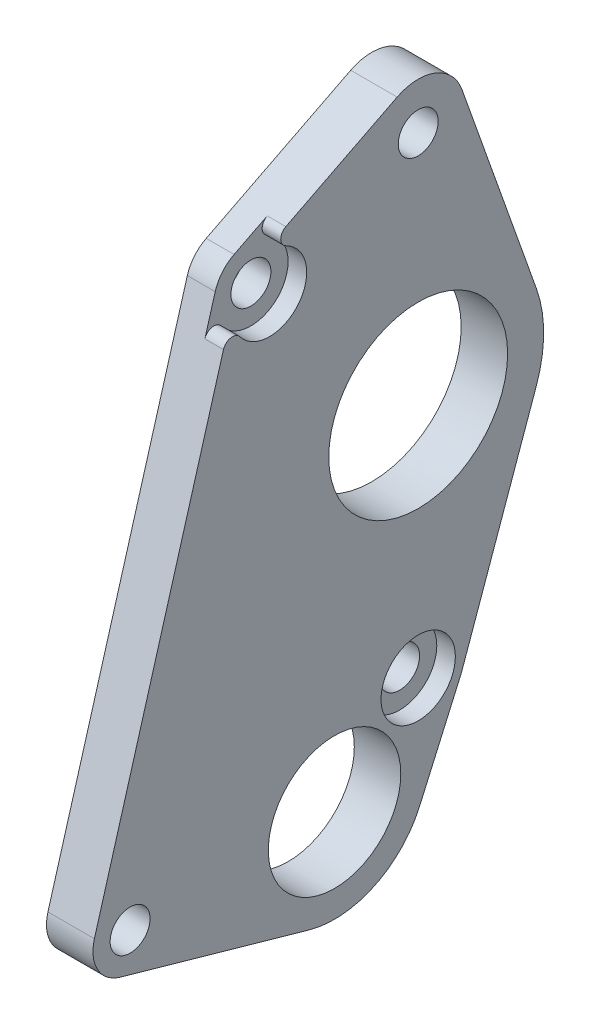
ISO-10303-21;
HEADER;
FILE_DESCRIPTION(('STEP AP214'),'2;1');
FILE_NAME('part.step','',(''),(''),'','','');
FILE_SCHEMA(('AUTOMOTIVE_DESIGN { 1 0 10303 214 1 1 1 1 }'));
ENDSEC;
DATA;
#1=APPLICATION_CONTEXT('core data for automotive mechanical design processes');
#2=APPLICATION_PROTOCOL_DEFINITION('international standard','automotive_design',2000,#1);
#3=PRODUCT_CONTEXT('',#1,'mechanical');
#4=PRODUCT('Part','Part','',(#3));
#5=PRODUCT_RELATED_PRODUCT_CATEGORY('part','',(#4));
#6=PRODUCT_DEFINITION_FORMATION('','',#4);
#7=PRODUCT_DEFINITION_CONTEXT('part definition',#1,'design');
#8=PRODUCT_DEFINITION('design','',#6,#7);
#9=PRODUCT_DEFINITION_SHAPE('','',#8);
#10=(LENGTH_UNIT() NAMED_UNIT(*) SI_UNIT(.MILLI.,.METRE.));
#11=(NAMED_UNIT(*) PLANE_ANGLE_UNIT() SI_UNIT($,.RADIAN.));
#12=(NAMED_UNIT(*) SI_UNIT($,.STERADIAN.) SOLID_ANGLE_UNIT());
#13=UNCERTAINTY_MEASURE_WITH_UNIT(LENGTH_MEASURE(1.E-05),#10,'distance_accuracy_value','');
#14=(GEOMETRIC_REPRESENTATION_CONTEXT(3) GLOBAL_UNCERTAINTY_ASSIGNED_CONTEXT((#13)) GLOBAL_UNIT_ASSIGNED_CONTEXT((#10,
#11,#12)) REPRESENTATION_CONTEXT('',''));
#15=CARTESIAN_POINT('',(0.,0.,0.));
#16=DIRECTION('',(0.,0.,1.));
#17=DIRECTION('',(1.,0.,0.));
#18=AXIS2_PLACEMENT_3D('',#15,#16,#17);
#19=CARTESIAN_POINT('',(5.,51.8,7.));
#20=DIRECTION('',(-1.,0.,0.));
#21=DIRECTION('',(0.,0.,1.));
#22=AXIS2_PLACEMENT_3D('',#19,#20,#21);
#23=CYLINDRICAL_SURFACE('',#22,3.99999999999997);
#24=CARTESIAN_POINT('',(3.,51.8,7.));
#25=DIRECTION('',(1.,0.,0.));
#26=DIRECTION('',(0.,0.,-1.));
#27=AXIS2_PLACEMENT_3D('',#24,#25,#26);
#28=CIRCLE('',#27,3.99999999999997);
#29=CARTESIAN_POINT('',(3.,55.3668135394964,8.8104809235297));
#30=VERTEX_POINT('',#29);
#31=CARTESIAN_POINT('',(3.,52.9125925016181,10.8421527722545));
#32=VERTEX_POINT('',#31);
#33=EDGE_CURVE('E296',#30,#32,#28,.T.);
#34=ORIENTED_EDGE('',*,*,#33,.F.);
#35=DIRECTION('',(-1.,0.,0.));
#36=VECTOR('',#35,1.);
#37=CARTESIAN_POINT('',(5.,55.3668135394964,8.8104809235297));
#38=LINE('',#37,#36);
#39=CARTESIAN_POINT('',(0.,55.3668135394964,8.8104809235297));
#40=VERTEX_POINT('',#39);
#41=EDGE_CURVE('E275',#30,#40,#38,.T.);
#42=ORIENTED_EDGE('',*,*,#41,.T.);
#43=CARTESIAN_POINT('',(0.,51.8,7.));
#44=DIRECTION('',(1.,0.,0.));
#45=DIRECTION('',(0.,0.,-1.));
#46=AXIS2_PLACEMENT_3D('',#43,#44,#45);
#47=CIRCLE('',#46,3.99999999999997);
#48=CARTESIAN_POINT('',(0.,52.9125925016181,10.8421527722545));
#49=VERTEX_POINT('',#48);
#50=EDGE_CURVE('E267',#40,#49,#47,.T.);
#51=ORIENTED_EDGE('',*,*,#50,.T.);
#52=DIRECTION('',(-1.,0.,0.));
#53=VECTOR('',#52,1.);
#54=CARTESIAN_POINT('',(5.,52.9125925016181,10.8421527722545));
#55=LINE('',#54,#53);
#56=EDGE_CURVE('E273',#32,#49,#55,.T.);
#57=ORIENTED_EDGE('',*,*,#56,.F.);
#58=EDGE_LOOP('',(#34,#42,#51,#57));
#59=FACE_BOUND('',#58,.T.);
#60=ADVANCED_FACE('F48',(#59),#23,.T.);
#61=CARTESIAN_POINT('',(5.,51.8,7.));
#62=DIRECTION('',(-1.,0.,0.));
#63=DIRECTION('',(0.,0.,1.));
#64=AXIS2_PLACEMENT_3D('',#61,#62,#63);
#65=CYLINDRICAL_SURFACE('',#64,2.15);
#66=CARTESIAN_POINT('',(0.,51.8,7.));
#67=DIRECTION('',(1.,0.,0.));
#68=DIRECTION('',(0.,0.,-1.));
#69=AXIS2_PLACEMENT_3D('',#66,#67,#68);
#70=CIRCLE('',#69,2.15);
#71=CARTESIAN_POINT('',(0.,51.8,4.85));
#72=VERTEX_POINT('',#71);
#73=EDGE_CURVE('E215',#72,#72,#70,.T.);
#74=ORIENTED_EDGE('',*,*,#73,.F.);
#75=EDGE_LOOP('',(#74));
#76=FACE_BOUND('',#75,.T.);
#77=CARTESIAN_POINT('',(3.,51.8,7.));
#78=DIRECTION('',(1.,0.,0.));
#79=DIRECTION('',(0.,0.,-1.));
#80=AXIS2_PLACEMENT_3D('',#77,#78,#79);
#81=CIRCLE('',#80,2.15);
#82=CARTESIAN_POINT('',(3.,51.8,4.85));
#83=VERTEX_POINT('',#82);
#84=EDGE_CURVE('E196',#83,#83,#81,.T.);
#85=ORIENTED_EDGE('',*,*,#84,.T.);
#86=EDGE_LOOP('',(#85));
#87=FACE_BOUND('',#86,.T.);
#88=ADVANCED_FACE('F343',(#76,#87),#65,.F.);
#89=CARTESIAN_POINT('',(5.,7.99999999999999,-9.));
#90=DIRECTION('',(-1.,0.,0.));
#91=DIRECTION('',(0.,0.,1.));
#92=AXIS2_PLACEMENT_3D('',#89,#90,#91);
#93=CYLINDRICAL_SURFACE('',#92,2.15);
#94=CARTESIAN_POINT('',(0.,7.99999999999999,-9.));
#95=DIRECTION('',(1.,0.,0.));
#96=DIRECTION('',(0.,0.,-1.));
#97=AXIS2_PLACEMENT_3D('',#94,#95,#96);
#98=CIRCLE('',#97,2.15);
#99=CARTESIAN_POINT('',(0.,7.99999999999999,-11.15));
#100=VERTEX_POINT('',#99);
#101=EDGE_CURVE('E210',#100,#100,#98,.T.);
#102=ORIENTED_EDGE('',*,*,#101,.F.);
#103=EDGE_LOOP('',(#102));
#104=FACE_BOUND('',#103,.T.);
#105=CARTESIAN_POINT('',(3.,7.99999999999999,-9.));
#106=DIRECTION('',(1.,0.,0.));
#107=DIRECTION('',(0.,0.,-1.));
#108=AXIS2_PLACEMENT_3D('',#105,#106,#107);
#109=CIRCLE('',#108,2.15);
#110=CARTESIAN_POINT('',(3.,7.99999999999999,-11.15));
#111=VERTEX_POINT('',#110);
#112=EDGE_CURVE('E293',#111,#111,#109,.T.);
#113=ORIENTED_EDGE('',*,*,#112,.T.);
#114=EDGE_LOOP('',(#113));
#115=FACE_BOUND('',#114,.T.);
#116=ADVANCED_FACE('F337',(#104,#115),#93,.F.);
#117=CARTESIAN_POINT('',(5.,7.99999999999999,-9.));
#118=DIRECTION('',(-1.,0.,0.));
#119=DIRECTION('',(0.,0.,1.));
#120=AXIS2_PLACEMENT_3D('',#117,#118,#119);
#121=CYLINDRICAL_SURFACE('',#120,5.00000000000003);
#122=DIRECTION('',(1.,0.,0.));
#123=VECTOR('',#122,1.);
#124=CARTESIAN_POINT('',(0.,6.3267716535433,-13.7117201636572));
#125=LINE('',#124,#123);
#126=CARTESIAN_POINT('',(0.,6.3267716535433,-13.7117201636572));
#127=VERTEX_POINT('',#126);
#128=CARTESIAN_POINT('',(5.,6.3267716535433,-13.7117201636572));
#129=VERTEX_POINT('',#128);
#130=EDGE_CURVE('E179',#127,#129,#125,.T.);
#131=ORIENTED_EDGE('',*,*,#130,.T.);
#132=CARTESIAN_POINT('',(5.,7.99999999999999,-9.));
#133=DIRECTION('',(1.,0.,0.));
#134=DIRECTION('',(0.,0.,-1.));
#135=AXIS2_PLACEMENT_3D('',#132,#133,#134);
#136=CIRCLE('',#135,5.00000000000003);
#137=CARTESIAN_POINT('',(5.,5.9796530913472,-13.5736416965802));
#138=VERTEX_POINT('',#137);
#139=EDGE_CURVE('E241',#138,#129,#136,.T.);
#140=ORIENTED_EDGE('',*,*,#139,.F.);
#141=DIRECTION('',(-1.,0.,0.));
#142=VECTOR('',#141,1.);
#143=CARTESIAN_POINT('',(5.,5.9796530913472,-13.5736416965802));
#144=LINE('',#143,#142);
#145=CARTESIAN_POINT('',(0.,5.9796530913472,-13.5736416965802));
#146=VERTEX_POINT('',#145);
#147=EDGE_CURVE('E280',#138,#146,#144,.T.);
#148=ORIENTED_EDGE('',*,*,#147,.T.);
#149=CARTESIAN_POINT('',(0.,7.99999999999999,-9.));
#150=DIRECTION('',(1.,0.,0.));
#151=DIRECTION('',(0.,0.,-1.));
#152=AXIS2_PLACEMENT_3D('',#149,#150,#151);
#153=CIRCLE('',#152,5.00000000000003);
#154=EDGE_CURVE('E260',#146,#127,#153,.T.);
#155=ORIENTED_EDGE('',*,*,#154,.T.);
#156=EDGE_LOOP('',(#131,#140,#148,#155));
#157=FACE_BOUND('',#156,.T.);
#158=ADVANCED_FACE('F327',(#157),#121,.T.);
#159=CARTESIAN_POINT('',(5.,0.,22.));
#160=DIRECTION('',(1.,0.,0.));
#161=DIRECTION('',(0.,0.,-1.));
#162=AXIS2_PLACEMENT_3D('',#159,#160,#161);
#163=PLANE('',#162);
#164=DIRECTION('',(0.,-0.452620230882422,0.891703384874109));
#165=VECTOR('',#164,1.);
#166=CARTESIAN_POINT('',(5.,63.2585169243694,-6.73689884558576));
#167=LINE('',#166,#165);
#168=CARTESIAN_POINT('',(5.,63.2585169243694,-6.73689884558577));
#169=VERTEX_POINT('',#168);
#170=CARTESIAN_POINT('',(5.,57.1772944630261,5.24366738403326));
#171=VERTEX_POINT('',#170);
#172=EDGE_CURVE('E246',#169,#171,#167,.T.);
#173=ORIENTED_EDGE('',*,*,#172,.T.);
#174=CARTESIAN_POINT('',(5.,56.285591078152,4.79104715315083));
#175=DIRECTION('',(1.,0.,0.));
#176=DIRECTION('',(0.,0.,-1.));
#177=AXIS2_PLACEMENT_3D('',#174,#175,#176);
#178=CIRCLE('',#177,1.);
#179=CARTESIAN_POINT('',(5.,55.3884728625216,5.23283772252067));
#180=VERTEX_POINT('',#179);
#181=EDGE_CURVE('E308',#171,#180,#178,.T.);
#182=ORIENTED_EDGE('',*,*,#181,.T.);
#183=CARTESIAN_POINT('',(5.,51.8,7.));
#184=DIRECTION('',(1.,0.,0.));
#185=DIRECTION('',(0.,0.,-1.));
#186=AXIS2_PLACEMENT_3D('',#183,#184,#185);
#187=CIRCLE('',#186,3.99999999999997);
#188=CARTESIAN_POINT('',(5.,49.3938332831672,10.1953656646472));
#189=VERTEX_POINT('',#188);
#190=EDGE_CURVE('E391',#189,#180,#187,.T.);
#191=ORIENTED_EDGE('',*,*,#190,.F.);
#192=CARTESIAN_POINT('',(5.,48.7922916039591,10.994207080809));
#193=DIRECTION('',(1.,0.,0.));
#194=DIRECTION('',(0.,0.,-1.));
#195=AXIS2_PLACEMENT_3D('',#192,#193,#194);
#196=CIRCLE('',#195,1.);
#197=CARTESIAN_POINT('',(5.,49.0704397293636,11.9547452738726));
#198=VERTEX_POINT('',#197);
#199=EDGE_CURVE('E306',#189,#198,#196,.T.);
#200=ORIENTED_EDGE('',*,*,#199,.T.);
#201=DIRECTION('',(0.,-0.960538193063632,0.278148125404527));
#202=VECTOR('',#201,1.);
#203=CARTESIAN_POINT('',(5.,52.9125925016181,10.8421527722545));
#204=LINE('',#203,#202);
#205=CARTESIAN_POINT('',(5.,1.11259250161809,25.8421527722545));
#206=VERTEX_POINT('',#205);
#207=EDGE_CURVE('E249',#198,#206,#204,.T.);
#208=ORIENTED_EDGE('',*,*,#207,.T.);
#209=CARTESIAN_POINT('',(5.,0.,22.));
#210=DIRECTION('',(1.,0.,0.));
#211=DIRECTION('',(0.,0.,-1.));
#212=AXIS2_PLACEMENT_3D('',#209,#210,#211);
#213=CIRCLE('',#212,3.99999999999999);
#214=CARTESIAN_POINT('',(5.,-3.84836554336669,23.0909090909091));
#215=VERTEX_POINT('',#214);
#216=EDGE_CURVE('E231',#206,#215,#213,.T.);
#217=ORIENTED_EDGE('',*,*,#216,.T.);
#218=DIRECTION('',(0.,-0.272727272727272,-0.96209138584167));
#219=VECTOR('',#218,1.);
#220=CARTESIAN_POINT('',(5.,-3.84836554336669,23.0909090909091));
#221=LINE('',#220,#219);
#222=CARTESIAN_POINT('',(5.,-9.62091385841669,2.7272727272727));
#223=VERTEX_POINT('',#222);
#224=EDGE_CURVE('E234',#215,#223,#221,.T.);
#225=ORIENTED_EDGE('',*,*,#224,.T.);
#226=CARTESIAN_POINT('',(5.,0.,0.));
#227=DIRECTION('',(1.,0.,0.));
#228=DIRECTION('',(0.,0.,-1.));
#229=AXIS2_PLACEMENT_3D('',#226,#227,#228);
#230=CIRCLE('',#229,9.99999999999999);
#231=CARTESIAN_POINT('',(5.,-4.0406938173055,-9.14728339316045));
#232=VERTEX_POINT('',#231);
#233=EDGE_CURVE('E237',#223,#232,#230,.T.);
#234=ORIENTED_EDGE('',*,*,#233,.T.);
#235=DIRECTION('',(0.,0.914728339316044,-0.404069381730553));
#236=VECTOR('',#235,1.);
#237=CARTESIAN_POINT('',(5.,-4.0406938173055,-9.14728339316046));
#238=LINE('',#237,#236);
#239=EDGE_CURVE('E239',#232,#138,#238,.T.);
#240=ORIENTED_EDGE('',*,*,#239,.T.);
#241=ORIENTED_EDGE('',*,*,#139,.T.);
#242=DIRECTION('',(0.,-0.94234403273144,0.334645669291337));
#243=VECTOR('',#242,1.);
#244=CARTESIAN_POINT('',(5.,-3.61548870047811,-10.1810198515893));
#245=LINE('',#244,#243);
#246=CARTESIAN_POINT('',(5.,28.8822834645669,-21.7216444418744));
#247=VERTEX_POINT('',#246);
#248=EDGE_CURVE('E194',#247,#129,#245,.T.);
#249=ORIENTED_EDGE('',*,*,#248,.F.);
#250=CARTESIAN_POINT('',(5.,33.4,-9.));
#251=DIRECTION('',(1.,0.,0.));
#252=DIRECTION('',(0.,0.,-1.));
#253=AXIS2_PLACEMENT_3D('',#250,#251,#252);
#254=CIRCLE('',#253,13.5);
#255=CARTESIAN_POINT('',(5.,37.9177165354344,-21.721644441874));
#256=VERTEX_POINT('',#255);
#257=EDGE_CURVE('E169',#247,#256,#254,.T.);
#258=ORIENTED_EDGE('',*,*,#257,.T.);
#259=DIRECTION('',(0.,-0.942344032731405,-0.334645669291436));
#260=VECTOR('',#259,1.);
#261=CARTESIAN_POINT('',(5.,11.0962686620423,-31.2464900006032));
#262=LINE('',#261,#260);
#263=CARTESIAN_POINT('',(5.,60.4732283464561,-13.7117201636548));
#264=VERTEX_POINT('',#263);
#265=EDGE_CURVE('E198',#264,#256,#262,.T.);
#266=ORIENTED_EDGE('',*,*,#265,.F.);
#267=CARTESIAN_POINT('',(5.,58.7999999999989,-8.99999999999785));
#268=DIRECTION('',(1.,0.,0.));
#269=DIRECTION('',(0.,0.,-1.));
#270=AXIS2_PLACEMENT_3D('',#267,#268,#269);
#271=CIRCLE('',#270,4.99999999999992);
#272=EDGE_CURVE('E244',#264,#169,#271,.T.);
#273=ORIENTED_EDGE('',*,*,#272,.T.);
#274=EDGE_LOOP('',(#173,#182,#191,#200,#208,#217,#225,#234,#240,#241,#249,#258,#266,#273));
#275=FACE_BOUND('',#274,.T.);
#276=CARTESIAN_POINT('',(5.,7.99999999999999,-9.));
#277=DIRECTION('',(1.,0.,0.));
#278=DIRECTION('',(0.,0.,-1.));
#279=AXIS2_PLACEMENT_3D('',#276,#277,#278);
#280=CIRCLE('',#279,3.99999999999997);
#281=CARTESIAN_POINT('',(5.,7.99999999999999,-13.));
#282=VERTEX_POINT('',#281);
#283=EDGE_CURVE('E422',#282,#282,#280,.T.);
#284=ORIENTED_EDGE('',*,*,#283,.F.);
#285=EDGE_LOOP('',(#284));
#286=FACE_BOUND('',#285,.T.);
#287=CARTESIAN_POINT('',(5.,0.,22.));
#288=DIRECTION('',(1.,0.,0.));
#289=DIRECTION('',(0.,0.,-1.));
#290=AXIS2_PLACEMENT_3D('',#287,#288,#289);
#291=CIRCLE('',#290,2.15);
#292=CARTESIAN_POINT('',(5.,0.,19.85));
#293=VERTEX_POINT('',#292);
#294=EDGE_CURVE('E219',#293,#293,#291,.T.);
#295=ORIENTED_EDGE('',*,*,#294,.F.);
#296=EDGE_LOOP('',(#295));
#297=FACE_BOUND('',#296,.T.);
#298=CARTESIAN_POINT('',(5.,58.8,-9.));
#299=DIRECTION('',(1.,0.,0.));
#300=DIRECTION('',(0.,0.,-1.));
#301=AXIS2_PLACEMENT_3D('',#298,#299,#300);
#302=CIRCLE('',#301,2.15);
#303=CARTESIAN_POINT('',(5.,58.8,-11.15));
#304=VERTEX_POINT('',#303);
#305=EDGE_CURVE('E225',#304,#304,#302,.T.);
#306=ORIENTED_EDGE('',*,*,#305,.F.);
#307=EDGE_LOOP('',(#306));
#308=FACE_BOUND('',#307,.T.);
#309=CARTESIAN_POINT('',(5.,0.,0.));
#310=DIRECTION('',(1.,0.,0.));
#311=DIRECTION('',(0.,0.,-1.));
#312=AXIS2_PLACEMENT_3D('',#309,#310,#311);
#313=CIRCLE('',#312,7.125);
#314=CARTESIAN_POINT('',(5.,0.,-7.125));
#315=VERTEX_POINT('',#314);
#316=EDGE_CURVE('E207',#315,#315,#313,.T.);
#317=ORIENTED_EDGE('',*,*,#316,.F.);
#318=EDGE_LOOP('',(#317));
#319=FACE_BOUND('',#318,.T.);
#320=CARTESIAN_POINT('',(5.,33.4,-9.));
#321=DIRECTION('',(1.,0.,0.));
#322=DIRECTION('',(0.,0.,-1.));
#323=AXIS2_PLACEMENT_3D('',#320,#321,#322);
#324=CIRCLE('',#323,9.625);
#325=CARTESIAN_POINT('',(5.,33.4,-18.625));
#326=VERTEX_POINT('',#325);
#327=EDGE_CURVE('E52',#326,#326,#324,.T.);
#328=ORIENTED_EDGE('',*,*,#327,.F.);
#329=EDGE_LOOP('',(#328));
#330=FACE_BOUND('',#329,.T.);
#331=ADVANCED_FACE('F325',(#275,#286,#297,#308,#319,#330),#163,.T.);
#332=CARTESIAN_POINT('',(0.,0.,22.));
#333=DIRECTION('',(1.,0.,0.));
#334=DIRECTION('',(0.,0.,-1.));
#335=AXIS2_PLACEMENT_3D('',#332,#333,#334);
#336=PLANE('',#335);
#337=CARTESIAN_POINT('',(0.,0.,22.));
#338=DIRECTION('',(1.,0.,0.));
#339=DIRECTION('',(0.,0.,-1.));
#340=AXIS2_PLACEMENT_3D('',#337,#338,#339);
#341=CIRCLE('',#340,3.99999999999999);
#342=CARTESIAN_POINT('',(0.,1.11259250161809,25.8421527722545));
#343=VERTEX_POINT('',#342);
#344=CARTESIAN_POINT('',(0.,-3.84836554336669,23.0909090909091));
#345=VERTEX_POINT('',#344);
#346=EDGE_CURVE('E228',#343,#345,#341,.T.);
#347=ORIENTED_EDGE('',*,*,#346,.F.);
#348=DIRECTION('',(0.,-0.960538193063632,0.278148125404527));
#349=VECTOR('',#348,1.);
#350=CARTESIAN_POINT('',(0.,52.9125925016181,10.8421527722545));
#351=LINE('',#350,#349);
#352=EDGE_CURVE('E235',#49,#343,#351,.T.);
#353=ORIENTED_EDGE('',*,*,#352,.F.);
#354=ORIENTED_EDGE('',*,*,#50,.F.);
#355=DIRECTION('',(0.,-0.452620230882422,0.891703384874109));
#356=VECTOR('',#355,1.);
#357=CARTESIAN_POINT('',(0.,63.2585169243694,-6.73689884558576));
#358=LINE('',#357,#356);
#359=CARTESIAN_POINT('',(0.,63.2585169243694,-6.73689884558577));
#360=VERTEX_POINT('',#359);
#361=EDGE_CURVE('E264',#360,#40,#358,.T.);
#362=ORIENTED_EDGE('',*,*,#361,.F.);
#363=CARTESIAN_POINT('',(0.,58.7999999999989,-8.99999999999785));
#364=DIRECTION('',(1.,0.,0.));
#365=DIRECTION('',(0.,0.,-1.));
#366=AXIS2_PLACEMENT_3D('',#363,#364,#365);
#367=CIRCLE('',#366,4.99999999999992);
#368=CARTESIAN_POINT('',(0.,60.4732283464561,-13.7117201636548));
#369=VERTEX_POINT('',#368);
#370=EDGE_CURVE('E262',#369,#360,#367,.T.);
#371=ORIENTED_EDGE('',*,*,#370,.F.);
#372=DIRECTION('',(0.,-0.942344032731405,-0.334645669291436));
#373=VECTOR('',#372,1.);
#374=CARTESIAN_POINT('',(0.,11.0962686620423,-31.2464900006032));
#375=LINE('',#374,#373);
#376=CARTESIAN_POINT('',(0.,37.9177165354344,-21.721644441874));
#377=VERTEX_POINT('',#376);
#378=EDGE_CURVE('E188',#369,#377,#375,.T.);
#379=ORIENTED_EDGE('',*,*,#378,.T.);
#380=CARTESIAN_POINT('',(0.,33.4,-9.));
#381=DIRECTION('',(1.,0.,0.));
#382=DIRECTION('',(0.,0.,-1.));
#383=AXIS2_PLACEMENT_3D('',#380,#381,#382);
#384=CIRCLE('',#383,13.5);
#385=CARTESIAN_POINT('',(0.,28.8822834645669,-21.7216444418744));
#386=VERTEX_POINT('',#385);
#387=EDGE_CURVE('E167',#386,#377,#384,.T.);
#388=ORIENTED_EDGE('',*,*,#387,.F.);
#389=DIRECTION('',(0.,-0.94234403273144,0.334645669291337));
#390=VECTOR('',#389,1.);
#391=CARTESIAN_POINT('',(0.,-3.61548870047811,-10.1810198515893));
#392=LINE('',#391,#390);
#393=EDGE_CURVE('E176',#386,#127,#392,.T.);
#394=ORIENTED_EDGE('',*,*,#393,.T.);
#395=ORIENTED_EDGE('',*,*,#154,.F.);
#396=DIRECTION('',(0.,0.914728339316044,-0.404069381730553));
#397=VECTOR('',#396,1.);
#398=CARTESIAN_POINT('',(0.,-4.0406938173055,-9.14728339316046));
#399=LINE('',#398,#397);
#400=CARTESIAN_POINT('',(0.,-4.0406938173055,-9.14728339316045));
#401=VERTEX_POINT('',#400);
#402=EDGE_CURVE('E258',#401,#146,#399,.T.);
#403=ORIENTED_EDGE('',*,*,#402,.F.);
#404=CARTESIAN_POINT('',(0.,0.,0.));
#405=DIRECTION('',(1.,0.,0.));
#406=DIRECTION('',(0.,0.,-1.));
#407=AXIS2_PLACEMENT_3D('',#404,#405,#406);
#408=CIRCLE('',#407,9.99999999999999);
#409=CARTESIAN_POINT('',(0.,-9.62091385841669,2.7272727272727));
#410=VERTEX_POINT('',#409);
#411=EDGE_CURVE('E256',#410,#401,#408,.T.);
#412=ORIENTED_EDGE('',*,*,#411,.F.);
#413=DIRECTION('',(0.,-0.272727272727272,-0.96209138584167));
#414=VECTOR('',#413,1.);
#415=CARTESIAN_POINT('',(0.,-3.84836554336669,23.0909090909091));
#416=LINE('',#415,#414);
#417=EDGE_CURVE('E254',#345,#410,#416,.T.);
#418=ORIENTED_EDGE('',*,*,#417,.F.);
#419=EDGE_LOOP('',(#347,#353,#354,#362,#371,#379,#388,#394,#395,#403,#412,#418));
#420=FACE_BOUND('',#419,.T.);
#421=CARTESIAN_POINT('',(0.,58.8,-9.));
#422=DIRECTION('',(1.,0.,0.));
#423=DIRECTION('',(0.,0.,-1.));
#424=AXIS2_PLACEMENT_3D('',#421,#422,#423);
#425=CIRCLE('',#424,2.15);
#426=CARTESIAN_POINT('',(0.,58.8,-11.15));
#427=VERTEX_POINT('',#426);
#428=EDGE_CURVE('E222',#427,#427,#425,.T.);
#429=ORIENTED_EDGE('',*,*,#428,.T.);
#430=EDGE_LOOP('',(#429));
#431=FACE_BOUND('',#430,.T.);
#432=CARTESIAN_POINT('',(0.,0.,22.));
#433=DIRECTION('',(1.,0.,0.));
#434=DIRECTION('',(0.,0.,-1.));
#435=AXIS2_PLACEMENT_3D('',#432,#433,#434);
#436=CIRCLE('',#435,2.15);
#437=CARTESIAN_POINT('',(0.,0.,19.85));
#438=VERTEX_POINT('',#437);
#439=EDGE_CURVE('E218',#438,#438,#436,.T.);
#440=ORIENTED_EDGE('',*,*,#439,.T.);
#441=EDGE_LOOP('',(#440));
#442=FACE_BOUND('',#441,.T.);
#443=ORIENTED_EDGE('',*,*,#73,.T.);
#444=EDGE_LOOP('',(#443));
#445=FACE_BOUND('',#444,.T.);
#446=ORIENTED_EDGE('',*,*,#101,.T.);
#447=EDGE_LOOP('',(#446));
#448=FACE_BOUND('',#447,.T.);
#449=CARTESIAN_POINT('',(0.,0.,0.));
#450=DIRECTION('',(1.,0.,0.));
#451=DIRECTION('',(0.,0.,-1.));
#452=AXIS2_PLACEMENT_3D('',#449,#450,#451);
#453=CIRCLE('',#452,7.125);
#454=CARTESIAN_POINT('',(0.,0.,-7.125));
#455=VERTEX_POINT('',#454);
#456=EDGE_CURVE('E202',#455,#455,#453,.T.);
#457=ORIENTED_EDGE('',*,*,#456,.T.);
#458=EDGE_LOOP('',(#457));
#459=FACE_BOUND('',#458,.T.);
#460=CARTESIAN_POINT('',(0.,33.4,-9.));
#461=DIRECTION('',(1.,0.,0.));
#462=DIRECTION('',(0.,0.,-1.));
#463=AXIS2_PLACEMENT_3D('',#460,#461,#462);
#464=CIRCLE('',#463,9.625);
#465=CARTESIAN_POINT('',(0.,33.4,-18.625));
#466=VERTEX_POINT('',#465);
#467=EDGE_CURVE('E173',#466,#466,#464,.T.);
#468=ORIENTED_EDGE('',*,*,#467,.T.);
#469=EDGE_LOOP('',(#468));
#470=FACE_BOUND('',#469,.T.);
#471=ADVANCED_FACE('F185',(#420,#431,#442,#445,#448,#459,#470),#336,.F.);
#472=CARTESIAN_POINT('',(5.,0.,22.));
#473=DIRECTION('',(-1.,0.,0.));
#474=DIRECTION('',(0.,0.,1.));
#475=AXIS2_PLACEMENT_3D('',#472,#473,#474);
#476=CYLINDRICAL_SURFACE('',#475,3.99999999999999);
#477=ORIENTED_EDGE('',*,*,#346,.T.);
#478=DIRECTION('',(-1.,0.,0.));
#479=VECTOR('',#478,1.);
#480=CARTESIAN_POINT('',(5.,-3.84836554336669,23.0909090909091));
#481=LINE('',#480,#479);
#482=EDGE_CURVE('E289',#215,#345,#481,.T.);
#483=ORIENTED_EDGE('',*,*,#482,.F.);
#484=ORIENTED_EDGE('',*,*,#216,.F.);
#485=DIRECTION('',(-1.,0.,0.));
#486=VECTOR('',#485,1.);
#487=CARTESIAN_POINT('',(5.,1.11259250161809,25.8421527722545));
#488=LINE('',#487,#486);
#489=EDGE_CURVE('E251',#206,#343,#488,.T.);
#490=ORIENTED_EDGE('',*,*,#489,.T.);
#491=EDGE_LOOP('',(#477,#483,#484,#490));
#492=FACE_BOUND('',#491,.T.);
#493=ADVANCED_FACE('F334',(#492),#476,.T.);
#494=CARTESIAN_POINT('',(5.,-3.84836554336669,23.0909090909091));
#495=DIRECTION('',(0.,0.96209138584167,-0.272727272727272));
#496=DIRECTION('',(0.,0.272727272727272,0.96209138584167));
#497=AXIS2_PLACEMENT_3D('',#494,#495,#496);
#498=PLANE('',#497);
#499=ORIENTED_EDGE('',*,*,#417,.T.);
#500=DIRECTION('',(-1.,0.,0.));
#501=VECTOR('',#500,1.);
#502=CARTESIAN_POINT('',(5.,-9.62091385841669,2.7272727272727));
#503=LINE('',#502,#501);
#504=EDGE_CURVE('E286',#223,#410,#503,.T.);
#505=ORIENTED_EDGE('',*,*,#504,.F.);
#506=ORIENTED_EDGE('',*,*,#224,.F.);
#507=ORIENTED_EDGE('',*,*,#482,.T.);
#508=EDGE_LOOP('',(#499,#505,#506,#507));
#509=FACE_BOUND('',#508,.T.);
#510=ADVANCED_FACE('F371',(#509),#498,.F.);
#511=CARTESIAN_POINT('',(5.,0.,0.));
#512=DIRECTION('',(-1.,0.,0.));
#513=DIRECTION('',(0.,0.,1.));
#514=AXIS2_PLACEMENT_3D('',#511,#512,#513);
#515=CYLINDRICAL_SURFACE('',#514,9.99999999999999);
#516=ORIENTED_EDGE('',*,*,#411,.T.);
#517=DIRECTION('',(-1.,0.,0.));
#518=VECTOR('',#517,1.);
#519=CARTESIAN_POINT('',(5.,-4.0406938173055,-9.14728339316045));
#520=LINE('',#519,#518);
#521=EDGE_CURVE('E283',#232,#401,#520,.T.);
#522=ORIENTED_EDGE('',*,*,#521,.F.);
#523=ORIENTED_EDGE('',*,*,#233,.F.);
#524=ORIENTED_EDGE('',*,*,#504,.T.);
#525=EDGE_LOOP('',(#516,#522,#523,#524));
#526=FACE_BOUND('',#525,.T.);
#527=ADVANCED_FACE('F367',(#526),#515,.T.);
#528=CARTESIAN_POINT('',(5.,-4.0406938173055,-9.14728339316046));
#529=DIRECTION('',(0.,0.404069381730553,0.914728339316044));
#530=DIRECTION('',(0.,-0.914728339316045,0.404069381730553));
#531=AXIS2_PLACEMENT_3D('',#528,#529,#530);
#532=PLANE('',#531);
#533=ORIENTED_EDGE('',*,*,#402,.T.);
#534=ORIENTED_EDGE('',*,*,#147,.F.);
#535=ORIENTED_EDGE('',*,*,#239,.F.);
#536=ORIENTED_EDGE('',*,*,#521,.T.);
#537=EDGE_LOOP('',(#533,#534,#535,#536));
#538=FACE_BOUND('',#537,.T.);
#539=ADVANCED_FACE('F362',(#538),#532,.F.);
#540=CARTESIAN_POINT('',(5.,58.7999999999989,-8.99999999999785));
#541=DIRECTION('',(-1.,0.,0.));
#542=DIRECTION('',(0.,0.,1.));
#543=AXIS2_PLACEMENT_3D('',#540,#541,#542);
#544=CYLINDRICAL_SURFACE('',#543,4.99999999999992);
#545=ORIENTED_EDGE('',*,*,#272,.F.);
#546=DIRECTION('',(1.,0.,0.));
#547=VECTOR('',#546,1.);
#548=CARTESIAN_POINT('',(0.,60.4732283464561,-13.7117201636548));
#549=LINE('',#548,#547);
#550=EDGE_CURVE('E203',#369,#264,#549,.T.);
#551=ORIENTED_EDGE('',*,*,#550,.F.);
#552=ORIENTED_EDGE('',*,*,#370,.T.);
#553=DIRECTION('',(-1.,0.,0.));
#554=VECTOR('',#553,1.);
#555=CARTESIAN_POINT('',(5.,63.2585169243694,-6.73689884558577));
#556=LINE('',#555,#554);
#557=EDGE_CURVE('E277',#169,#360,#556,.T.);
#558=ORIENTED_EDGE('',*,*,#557,.F.);
#559=EDGE_LOOP('',(#545,#551,#552,#558));
#560=FACE_BOUND('',#559,.T.);
#561=ADVANCED_FACE('F359',(#560),#544,.T.);
#562=CARTESIAN_POINT('',(5.,63.2585169243694,-6.73689884558576));
#563=DIRECTION('',(0.,-0.891703384874109,-0.452620230882422));
#564=DIRECTION('',(0.,0.452620230882422,-0.891703384874109));
#565=AXIS2_PLACEMENT_3D('',#562,#563,#564);
#566=PLANE('',#565);
#567=ORIENTED_EDGE('',*,*,#41,.F.);
#568=DIRECTION('',(0.,0.452620230882422,-0.891703384874109));
#569=VECTOR('',#568,1.);
#570=CARTESIAN_POINT('',(3.,55.3668135394964,8.81048092352968));
#571=LINE('',#570,#569);
#572=CARTESIAN_POINT('',(3.,57.1772944630261,5.24366738403325));
#573=VERTEX_POINT('',#572);
#574=EDGE_CURVE('E65',#30,#573,#571,.T.);
#575=ORIENTED_EDGE('',*,*,#574,.T.);
#576=DIRECTION('',(1.,0.,0.));
#577=VECTOR('',#576,1.);
#578=CARTESIAN_POINT('',(5.,57.1772944630261,5.24366738403326));
#579=LINE('',#578,#577);
#580=EDGE_CURVE('E303',#573,#171,#579,.T.);
#581=ORIENTED_EDGE('',*,*,#580,.T.);
#582=ORIENTED_EDGE('',*,*,#172,.F.);
#583=ORIENTED_EDGE('',*,*,#557,.T.);
#584=ORIENTED_EDGE('',*,*,#361,.T.);
#585=EDGE_LOOP('',(#567,#575,#581,#582,#583,#584));
#586=FACE_BOUND('',#585,.T.);
#587=ADVANCED_FACE('F356',(#586),#566,.F.);
#588=CARTESIAN_POINT('',(5.,52.9125925016181,10.8421527722545));
#589=DIRECTION('',(0.,-0.278148125404527,-0.960538193063632));
#590=DIRECTION('',(0.,0.960538193063632,-0.278148125404527));
#591=AXIS2_PLACEMENT_3D('',#588,#589,#590);
#592=PLANE('',#591);
#593=ORIENTED_EDGE('',*,*,#207,.F.);
#594=DIRECTION('',(1.,0.,0.));
#595=VECTOR('',#594,1.);
#596=CARTESIAN_POINT('',(5.,49.0704397293636,11.9547452738726));
#597=LINE('',#596,#595);
#598=CARTESIAN_POINT('',(3.,49.0704397293636,11.9547452738726));
#599=VERTEX_POINT('',#598);
#600=EDGE_CURVE('E312',#198,#599,#597,.F.);
#601=ORIENTED_EDGE('',*,*,#600,.T.);
#602=DIRECTION('',(0.,0.960538193063632,-0.278148125404527));
#603=VECTOR('',#602,1.);
#604=CARTESIAN_POINT('',(3.,52.9125925016181,10.8421527722545));
#605=LINE('',#604,#603);
#606=EDGE_CURVE('E310',#599,#32,#605,.T.);
#607=ORIENTED_EDGE('',*,*,#606,.T.);
#608=ORIENTED_EDGE('',*,*,#56,.T.);
#609=ORIENTED_EDGE('',*,*,#352,.T.);
#610=ORIENTED_EDGE('',*,*,#489,.F.);
#611=EDGE_LOOP('',(#593,#601,#607,#608,#609,#610));
#612=FACE_BOUND('',#611,.T.);
#613=ADVANCED_FACE('F355',(#612),#592,.F.);
#614=CARTESIAN_POINT('',(5.,58.8,-9.));
#615=DIRECTION('',(-1.,0.,0.));
#616=DIRECTION('',(0.,0.,1.));
#617=AXIS2_PLACEMENT_3D('',#614,#615,#616);
#618=CYLINDRICAL_SURFACE('',#617,2.15);
#619=ORIENTED_EDGE('',*,*,#305,.T.);
#620=EDGE_LOOP('',(#619));
#621=FACE_BOUND('',#620,.T.);
#622=ORIENTED_EDGE('',*,*,#428,.F.);
#623=EDGE_LOOP('',(#622));
#624=FACE_BOUND('',#623,.T.);
#625=ADVANCED_FACE('F455',(#621,#624),#618,.F.);
#626=CARTESIAN_POINT('',(5.,0.,22.));
#627=DIRECTION('',(-1.,0.,0.));
#628=DIRECTION('',(0.,0.,1.));
#629=AXIS2_PLACEMENT_3D('',#626,#627,#628);
#630=CYLINDRICAL_SURFACE('',#629,2.15);
#631=ORIENTED_EDGE('',*,*,#294,.T.);
#632=EDGE_LOOP('',(#631));
#633=FACE_BOUND('',#632,.T.);
#634=ORIENTED_EDGE('',*,*,#439,.F.);
#635=EDGE_LOOP('',(#634));
#636=FACE_BOUND('',#635,.T.);
#637=ADVANCED_FACE('F446',(#633,#636),#630,.F.);
#638=CARTESIAN_POINT('',(5.,0.,0.));
#639=DIRECTION('',(-1.,0.,0.));
#640=DIRECTION('',(0.,0.,1.));
#641=AXIS2_PLACEMENT_3D('',#638,#639,#640);
#642=CYLINDRICAL_SURFACE('',#641,7.125);
#643=ORIENTED_EDGE('',*,*,#316,.T.);
#644=EDGE_LOOP('',(#643));
#645=FACE_BOUND('',#644,.T.);
#646=ORIENTED_EDGE('',*,*,#456,.F.);
#647=EDGE_LOOP('',(#646));
#648=FACE_BOUND('',#647,.T.);
#649=ADVANCED_FACE('F443',(#645,#648),#642,.F.);
#650=CARTESIAN_POINT('',(0.,-3.61548870047811,-10.1810198515893));
#651=DIRECTION('',(0.,0.334645669291337,0.94234403273144));
#652=DIRECTION('',(0.,-0.94234403273144,0.334645669291337));
#653=AXIS2_PLACEMENT_3D('',#650,#651,#652);
#654=PLANE('',#653);
#655=ORIENTED_EDGE('',*,*,#248,.T.);
#656=ORIENTED_EDGE('',*,*,#130,.F.);
#657=ORIENTED_EDGE('',*,*,#393,.F.);
#658=DIRECTION('',(1.,0.,0.));
#659=VECTOR('',#658,1.);
#660=CARTESIAN_POINT('',(0.,28.8822834645669,-21.7216444418744));
#661=LINE('',#660,#659);
#662=EDGE_CURVE('E163',#386,#247,#661,.T.);
#663=ORIENTED_EDGE('',*,*,#662,.T.);
#664=EDGE_LOOP('',(#655,#656,#657,#663));
#665=FACE_BOUND('',#664,.T.);
#666=ADVANCED_FACE('F177',(#665),#654,.F.);
#667=CARTESIAN_POINT('',(0.,11.0962686620423,-31.2464900006032));
#668=DIRECTION('',(0.,-0.334645669291436,0.942344032731405));
#669=DIRECTION('',(0.,-0.942344032731405,-0.334645669291436));
#670=AXIS2_PLACEMENT_3D('',#667,#668,#669);
#671=PLANE('',#670);
#672=ORIENTED_EDGE('',*,*,#265,.T.);
#673=DIRECTION('',(1.,0.,0.));
#674=VECTOR('',#673,1.);
#675=CARTESIAN_POINT('',(0.,37.9177165354344,-21.721644441874));
#676=LINE('',#675,#674);
#677=EDGE_CURVE('E172',#377,#256,#676,.T.);
#678=ORIENTED_EDGE('',*,*,#677,.F.);
#679=ORIENTED_EDGE('',*,*,#378,.F.);
#680=ORIENTED_EDGE('',*,*,#550,.T.);
#681=EDGE_LOOP('',(#672,#678,#679,#680));
#682=FACE_BOUND('',#681,.T.);
#683=ADVANCED_FACE('F412',(#682),#671,.F.);
#684=CARTESIAN_POINT('',(0.,33.4,-9.));
#685=DIRECTION('',(1.,0.,0.));
#686=DIRECTION('',(0.,0.,-1.));
#687=AXIS2_PLACEMENT_3D('',#684,#685,#686);
#688=CYLINDRICAL_SURFACE('',#687,13.5);
#689=ORIENTED_EDGE('',*,*,#257,.F.);
#690=ORIENTED_EDGE('',*,*,#662,.F.);
#691=ORIENTED_EDGE('',*,*,#387,.T.);
#692=ORIENTED_EDGE('',*,*,#677,.T.);
#693=EDGE_LOOP('',(#689,#690,#691,#692));
#694=FACE_BOUND('',#693,.T.);
#695=ADVANCED_FACE('F165',(#694),#688,.T.);
#696=CARTESIAN_POINT('',(0.,33.4,-9.));
#697=DIRECTION('',(1.,0.,0.));
#698=DIRECTION('',(0.,0.,-1.));
#699=AXIS2_PLACEMENT_3D('',#696,#697,#698);
#700=CYLINDRICAL_SURFACE('',#699,9.625);
#701=ORIENTED_EDGE('',*,*,#467,.F.);
#702=EDGE_LOOP('',(#701));
#703=FACE_BOUND('',#702,.T.);
#704=ORIENTED_EDGE('',*,*,#327,.T.);
#705=EDGE_LOOP('',(#704));
#706=FACE_BOUND('',#705,.T.);
#707=ADVANCED_FACE('F50',(#703,#706),#700,.F.);
#708=CARTESIAN_POINT('',(3.,7.99999999999999,-9.));
#709=DIRECTION('',(1.,0.,0.));
#710=DIRECTION('',(0.,0.,-1.));
#711=AXIS2_PLACEMENT_3D('',#708,#709,#710);
#712=CYLINDRICAL_SURFACE('',#711,3.99999999999997);
#713=CARTESIAN_POINT('',(3.,7.99999999999999,-9.));
#714=DIRECTION('',(1.,0.,0.));
#715=DIRECTION('',(0.,0.,-1.));
#716=AXIS2_PLACEMENT_3D('',#713,#714,#715);
#717=CIRCLE('',#716,3.99999999999997);
#718=CARTESIAN_POINT('',(3.,7.99999999999999,-13.));
#719=VERTEX_POINT('',#718);
#720=EDGE_CURVE('E426',#719,#719,#717,.T.);
#721=ORIENTED_EDGE('',*,*,#720,.F.);
#722=EDGE_LOOP('',(#721));
#723=FACE_BOUND('',#722,.T.);
#724=ORIENTED_EDGE('',*,*,#283,.T.);
#725=EDGE_LOOP('',(#724));
#726=FACE_BOUND('',#725,.T.);
#727=ADVANCED_FACE('F321',(#723,#726),#712,.F.);
#728=CARTESIAN_POINT('',(3.,7.99999999999999,-9.));
#729=DIRECTION('',(1.,0.,0.));
#730=DIRECTION('',(0.,0.,-1.));
#731=AXIS2_PLACEMENT_3D('',#728,#729,#730);
#732=PLANE('',#731);
#733=ORIENTED_EDGE('',*,*,#112,.F.);
#734=EDGE_LOOP('',(#733));
#735=FACE_BOUND('',#734,.T.);
#736=ORIENTED_EDGE('',*,*,#720,.T.);
#737=EDGE_LOOP('',(#736));
#738=FACE_BOUND('',#737,.T.);
#739=ADVANCED_FACE('F430',(#735,#738),#732,.T.);
#740=CARTESIAN_POINT('',(3.,51.8,7.));
#741=DIRECTION('',(1.,0.,0.));
#742=DIRECTION('',(0.,0.,-1.));
#743=AXIS2_PLACEMENT_3D('',#740,#741,#742);
#744=CYLINDRICAL_SURFACE('',#743,3.99999999999997);
#745=ORIENTED_EDGE('',*,*,#190,.T.);
#746=DIRECTION('',(1.,0.,0.));
#747=VECTOR('',#746,1.);
#748=CARTESIAN_POINT('',(3.,55.3884728625216,5.23283772252067));
#749=LINE('',#748,#747);
#750=CARTESIAN_POINT('',(3.,55.3884728625216,5.23283772252067));
#751=VERTEX_POINT('',#750);
#752=EDGE_CURVE('E300',#180,#751,#749,.F.);
#753=ORIENTED_EDGE('',*,*,#752,.T.);
#754=CARTESIAN_POINT('',(3.,49.3938332831672,10.1953656646472));
#755=VERTEX_POINT('',#754);
#756=EDGE_CURVE('E420',#755,#751,#28,.T.);
#757=ORIENTED_EDGE('',*,*,#756,.F.);
#758=DIRECTION('',(1.,0.,0.));
#759=VECTOR('',#758,1.);
#760=CARTESIAN_POINT('',(3.,49.3938332831672,10.1953656646472));
#761=LINE('',#760,#759);
#762=EDGE_CURVE('E292',#755,#189,#761,.T.);
#763=ORIENTED_EDGE('',*,*,#762,.T.);
#764=EDGE_LOOP('',(#745,#753,#757,#763));
#765=FACE_BOUND('',#764,.T.);
#766=ADVANCED_FACE('F419',(#765),#744,.F.);
#767=CARTESIAN_POINT('',(3.,51.8,7.));
#768=DIRECTION('',(1.,0.,0.));
#769=DIRECTION('',(0.,0.,-1.));
#770=AXIS2_PLACEMENT_3D('',#767,#768,#769);
#771=PLANE('',#770);
#772=ORIENTED_EDGE('',*,*,#84,.F.);
#773=EDGE_LOOP('',(#772));
#774=FACE_BOUND('',#773,.T.);
#775=ORIENTED_EDGE('',*,*,#33,.T.);
#776=ORIENTED_EDGE('',*,*,#606,.F.);
#777=CARTESIAN_POINT('',(3.,48.7922916039591,10.994207080809));
#778=DIRECTION('',(1.,0.,0.));
#779=DIRECTION('',(0.,0.,-1.));
#780=AXIS2_PLACEMENT_3D('',#777,#778,#779);
#781=CIRCLE('',#780,1.);
#782=EDGE_CURVE('E12',#599,#755,#781,.F.);
#783=ORIENTED_EDGE('',*,*,#782,.T.);
#784=ORIENTED_EDGE('',*,*,#756,.T.);
#785=CARTESIAN_POINT('',(3.,56.285591078152,4.79104715315083));
#786=DIRECTION('',(1.,0.,0.));
#787=DIRECTION('',(0.,0.,-1.));
#788=AXIS2_PLACEMENT_3D('',#785,#786,#787);
#789=CIRCLE('',#788,1.);
#790=EDGE_CURVE('E57',#751,#573,#789,.F.);
#791=ORIENTED_EDGE('',*,*,#790,.T.);
#792=ORIENTED_EDGE('',*,*,#574,.F.);
#793=EDGE_LOOP('',(#775,#776,#783,#784,#791,#792));
#794=FACE_BOUND('',#793,.T.);
#795=ADVANCED_FACE('F382',(#774,#794),#771,.T.);
#796=CARTESIAN_POINT('',(3.,56.285591078152,4.79104715315083));
#797=DIRECTION('',(1.,0.,0.));
#798=DIRECTION('',(0.,0.,-1.));
#799=AXIS2_PLACEMENT_3D('',#796,#797,#798);
#800=CYLINDRICAL_SURFACE('',#799,1.);
#801=ORIENTED_EDGE('',*,*,#181,.F.);
#802=ORIENTED_EDGE('',*,*,#580,.F.);
#803=ORIENTED_EDGE('',*,*,#790,.F.);
#804=ORIENTED_EDGE('',*,*,#752,.F.);
#805=EDGE_LOOP('',(#801,#802,#803,#804));
#806=FACE_BOUND('',#805,.T.);
#807=ADVANCED_FACE('F379',(#806),#800,.T.);
#808=CARTESIAN_POINT('',(3.,48.7922916039591,10.994207080809));
#809=DIRECTION('',(1.,0.,0.));
#810=DIRECTION('',(0.,0.,-1.));
#811=AXIS2_PLACEMENT_3D('',#808,#809,#810);
#812=CYLINDRICAL_SURFACE('',#811,1.);
#813=ORIENTED_EDGE('',*,*,#199,.F.);
#814=ORIENTED_EDGE('',*,*,#762,.F.);
#815=ORIENTED_EDGE('',*,*,#782,.F.);
#816=ORIENTED_EDGE('',*,*,#600,.F.);
#817=EDGE_LOOP('',(#813,#814,#815,#816));
#818=FACE_BOUND('',#817,.T.);
#819=ADVANCED_FACE('F381',(#818),#812,.T.);
#820=CLOSED_SHELL('',(#60,#88,#116,#158,#331,#471,#493,#510,#527,#539,#561,#587,#613,#625,#637,
#649,#666,#683,#695,#707,#727,#739,#766,#795,#807,#819));
#821=MANIFOLD_SOLID_BREP('B2',#820);
#822=ADVANCED_BREP_SHAPE_REPRESENTATION('',(#18,#821),#14);
#823=SHAPE_DEFINITION_REPRESENTATION(#9,#822);
ENDSEC;
END-ISO-10303-21;
